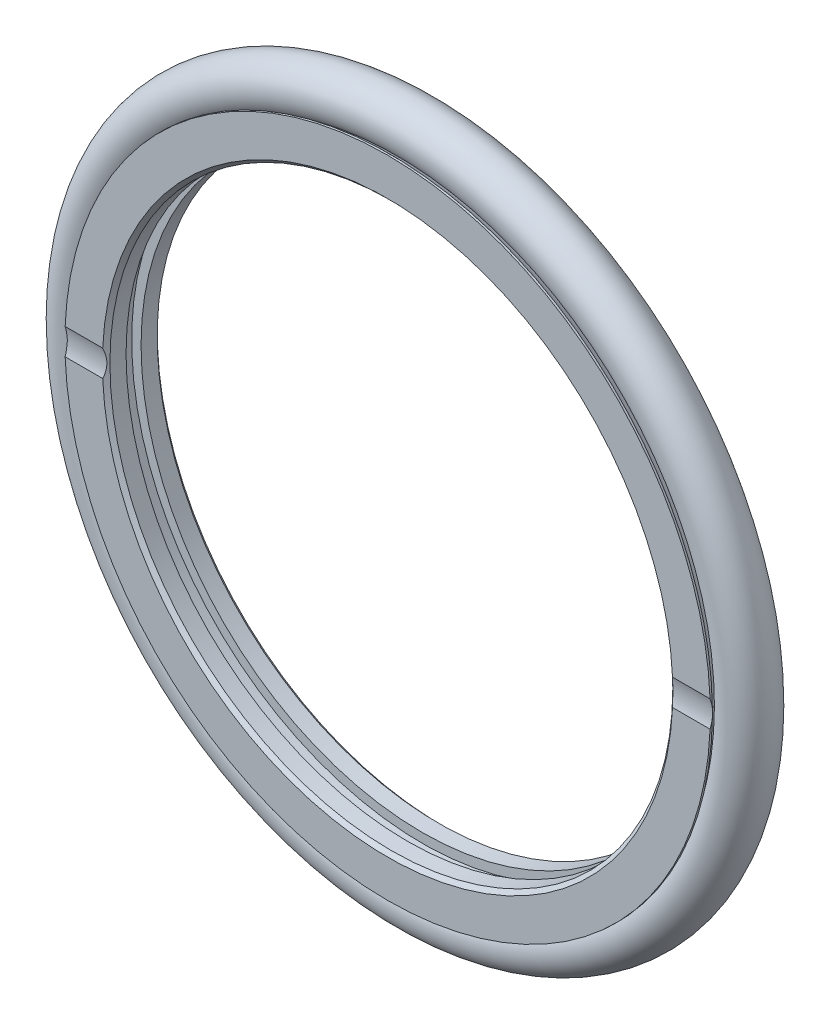
ISO-10303-21;
HEADER;
FILE_DESCRIPTION(('STEP AP214'),'2;1');
FILE_NAME('part.step','',(''),(''),'','','');
FILE_SCHEMA(('AUTOMOTIVE_DESIGN { 1 0 10303 214 1 1 1 1 }'));
ENDSEC;
DATA;
#1=APPLICATION_CONTEXT('core data for automotive mechanical design processes');
#2=APPLICATION_PROTOCOL_DEFINITION('international standard','automotive_design',2000,#1);
#3=PRODUCT_CONTEXT('',#1,'mechanical');
#4=PRODUCT('Part','Part','',(#3));
#5=PRODUCT_RELATED_PRODUCT_CATEGORY('part','',(#4));
#6=PRODUCT_DEFINITION_FORMATION('','',#4);
#7=PRODUCT_DEFINITION_CONTEXT('part definition',#1,'design');
#8=PRODUCT_DEFINITION('design','',#6,#7);
#9=PRODUCT_DEFINITION_SHAPE('','',#8);
#10=(LENGTH_UNIT() NAMED_UNIT(*) SI_UNIT(.MILLI.,.METRE.));
#11=(NAMED_UNIT(*) PLANE_ANGLE_UNIT() SI_UNIT($,.RADIAN.));
#12=(NAMED_UNIT(*) SI_UNIT($,.STERADIAN.) SOLID_ANGLE_UNIT());
#13=UNCERTAINTY_MEASURE_WITH_UNIT(LENGTH_MEASURE(1.E-05),#10,'distance_accuracy_value','');
#14=(GEOMETRIC_REPRESENTATION_CONTEXT(3) GLOBAL_UNCERTAINTY_ASSIGNED_CONTEXT((#13)) GLOBAL_UNIT_ASSIGNED_CONTEXT((#10,
#11,#12)) REPRESENTATION_CONTEXT('',''));
#15=CARTESIAN_POINT('',(0.,0.,0.));
#16=DIRECTION('',(0.,0.,1.));
#17=DIRECTION('',(1.,0.,0.));
#18=AXIS2_PLACEMENT_3D('',#15,#16,#17);
#19=CARTESIAN_POINT('',(0.,0.,0.));
#20=DIRECTION('',(0.,0.,1.));
#21=DIRECTION('',(1.,0.,0.));
#22=AXIS2_PLACEMENT_3D('',#19,#20,#21);
#23=TOROIDAL_SURFACE('',#22,17.805,1.31);
#24=CARTESIAN_POINT('',(19.115,0.,0.));
#25=VERTEX_POINT('',#24);
#26=VERTEX_LOOP('',#25);
#27=FACE_BOUND('',#26,.T.);
#28=ADVANCED_FACE('F53',(#27),#23,.T.);
#29=CLOSED_SHELL('',(#28));
#30=MANIFOLD_SOLID_BREP('B2',#29);
#31=CARTESIAN_POINT('',(0.,17.2,1.46));
#32=DIRECTION('',(0.,0.,-1.));
#33=DIRECTION('',(-1.,0.,0.));
#34=AXIS2_PLACEMENT_3D('',#31,#32,#33);
#35=PLANE('',#34);
#36=CARTESIAN_POINT('',(0.,0.,1.46));
#37=DIRECTION('',(0.,0.,1.));
#38=DIRECTION('',(1.,0.,0.));
#39=AXIS2_PLACEMENT_3D('',#36,#37,#38);
#40=CIRCLE('',#39,17.2);
#41=CARTESIAN_POINT('',(17.1857499109,0.7,1.46));
#42=VERTEX_POINT('',#41);
#43=CARTESIAN_POINT('',(-17.1857499109,0.7,1.46));
#44=VERTEX_POINT('',#43);
#45=EDGE_CURVE('E177',#42,#44,#40,.T.);
#46=ORIENTED_EDGE('',*,*,#45,.T.);
#47=DIRECTION('',(1.,0.,0.));
#48=VECTOR('',#47,1.);
#49=CARTESIAN_POINT('',(-17.2,0.7,1.46));
#50=LINE('',#49,#48);
#51=CARTESIAN_POINT('',(-15.1838730237051,0.7,1.46));
#52=VERTEX_POINT('',#51);
#53=EDGE_CURVE('E160',#44,#52,#50,.T.);
#54=ORIENTED_EDGE('',*,*,#53,.T.);
#55=CARTESIAN_POINT('',(0.,0.,1.46));
#56=DIRECTION('',(0.,0.,1.));
#57=DIRECTION('',(1.,0.,0.));
#58=AXIS2_PLACEMENT_3D('',#55,#56,#57);
#59=CIRCLE('',#58,15.2);
#60=CARTESIAN_POINT('',(15.1838730237051,0.7,1.46));
#61=VERTEX_POINT('',#60);
#62=EDGE_CURVE('E193',#61,#52,#59,.T.);
#63=ORIENTED_EDGE('',*,*,#62,.F.);
#64=EDGE_CURVE('E170',#61,#42,#50,.T.);
#65=ORIENTED_EDGE('',*,*,#64,.T.);
#66=EDGE_LOOP('',(#46,#54,#63,#65));
#67=FACE_BOUND('',#66,.T.);
#68=ADVANCED_FACE('F66',(#67),#35,.F.);
#69=CARTESIAN_POINT('',(0.,0.,0.));
#70=DIRECTION('',(0.,0.,1.));
#71=DIRECTION('',(1.,0.,0.));
#72=AXIS2_PLACEMENT_3D('',#69,#70,#71);
#73=CYLINDRICAL_SURFACE('',#72,17.2);
#74=CARTESIAN_POINT('',(0.,0.,1.35));
#75=DIRECTION('',(0.,0.,1.));
#76=DIRECTION('',(1.,0.,0.));
#77=AXIS2_PLACEMENT_3D('',#74,#75,#76);
#78=CIRCLE('',#77,17.2);
#79=CARTESIAN_POINT('',(-17.1987809645529,-0.204776300712103,1.35));
#80=VERTEX_POINT('',#79);
#81=CARTESIAN_POINT('',(17.1987809645529,-0.204776300712103,1.35));
#82=VERTEX_POINT('',#81);
#83=EDGE_CURVE('E197',#80,#82,#78,.T.);
#84=ORIENTED_EDGE('',*,*,#83,.T.);
#85=CARTESIAN_POINT('',(17.1987809645529,-0.204776300712103,1.35));
#86=CARTESIAN_POINT('',(17.1977392324289,-0.289562658618407,1.35834180085082));
#87=CARTESIAN_POINT('',(17.1961324452296,-0.373224479169303,1.37167936793952));
#88=CARTESIAN_POINT('',(17.1917887606792,-0.538299045599675,1.40834603460141));
#89=CARTESIAN_POINT('',(17.1890518633276,-0.619711791478078,1.43167513417938));
#90=CARTESIAN_POINT('',(17.1857499109,-0.7,1.46));
#91=B_SPLINE_CURVE_WITH_KNOTS('',3,(#85,#86,#87,#88,#89,#90),.UNSPECIFIED.,.F.,.F.,(4,2,4),(0.,
0.25420061783866,0.508401235798656),.UNSPECIFIED.);
#92=CARTESIAN_POINT('',(17.1857499109,-0.7,1.46));
#93=VERTEX_POINT('',#92);
#94=EDGE_CURVE('E89',#82,#93,#91,.T.);
#95=ORIENTED_EDGE('',*,*,#94,.T.);
#96=CARTESIAN_POINT('',(-17.1857499109,-0.7,1.46));
#97=VERTEX_POINT('',#96);
#98=EDGE_CURVE('E187',#97,#93,#40,.T.);
#99=ORIENTED_EDGE('',*,*,#98,.F.);
#100=CARTESIAN_POINT('',(-17.1857499109,-0.7,1.46));
#101=CARTESIAN_POINT('',(-17.1890518633276,-0.619711791478078,1.43167513417938));
#102=CARTESIAN_POINT('',(-17.1917887606792,-0.538299045599675,1.40834603460141));
#103=CARTESIAN_POINT('',(-17.1961324452296,-0.373224479169303,1.37167936793952));
#104=CARTESIAN_POINT('',(-17.1977392324289,-0.289562658618407,1.35834180085082));
#105=CARTESIAN_POINT('',(-17.1987809645529,-0.204776300712103,1.35));
#106=B_SPLINE_CURVE_WITH_KNOTS('',3,(#100,#101,#102,#103,#104,#105),.UNSPECIFIED.,.F.,.F.,(4,2,
4),(0.,0.254200617959995,0.508401235798656),.UNSPECIFIED.);
#107=EDGE_CURVE('E182',#97,#80,#106,.T.);
#108=ORIENTED_EDGE('',*,*,#107,.T.);
#109=EDGE_LOOP('',(#84,#95,#99,#108));
#110=FACE_BOUND('',#109,.T.);
#111=ADVANCED_FACE('F358',(#110),#73,.T.);
#112=CARTESIAN_POINT('',(0.,0.,0.));
#113=DIRECTION('',(0.,0.,1.));
#114=DIRECTION('',(1.,0.,0.));
#115=AXIS2_PLACEMENT_3D('',#112,#113,#114);
#116=CYLINDRICAL_SURFACE('',#115,17.2);
#117=CARTESIAN_POINT('',(0.,0.,-1.46));
#118=DIRECTION('',(0.,0.,1.));
#119=DIRECTION('',(1.,0.,0.));
#120=AXIS2_PLACEMENT_3D('',#117,#118,#119);
#121=CIRCLE('',#120,17.2);
#122=CARTESIAN_POINT('',(0.7,-17.1857499109,-1.46));
#123=VERTEX_POINT('',#122);
#124=CARTESIAN_POINT('',(0.7,17.1857499109,-1.46));
#125=VERTEX_POINT('',#124);
#126=EDGE_CURVE('E324',#123,#125,#121,.T.);
#127=ORIENTED_EDGE('',*,*,#126,.T.);
#128=CARTESIAN_POINT('',(0.7,17.1857499109,-1.46));
#129=CARTESIAN_POINT('',(0.619711791478081,17.1890518633276,-1.43167513417938));
#130=CARTESIAN_POINT('',(0.53829904559968,17.1917887606792,-1.40834603460141));
#131=CARTESIAN_POINT('',(0.373224479169314,17.1961324452296,-1.37167936793952));
#132=CARTESIAN_POINT('',(0.289562658618421,17.1977392324289,-1.35834180085082));
#133=CARTESIAN_POINT('',(0.20477630071212,17.1987809645529,-1.35));
#134=B_SPLINE_CURVE_WITH_KNOTS('',3,(#128,#129,#130,#131,#132,#133),.UNSPECIFIED.,.F.,.F.,(4,2,
4),(0.,0.254200617959987,0.508401235798639),.UNSPECIFIED.);
#135=CARTESIAN_POINT('',(0.20477630071212,17.1987809645529,-1.35));
#136=VERTEX_POINT('',#135);
#137=EDGE_CURVE('E253',#125,#136,#134,.T.);
#138=ORIENTED_EDGE('',*,*,#137,.T.);
#139=CARTESIAN_POINT('',(0.,0.,-1.35));
#140=DIRECTION('',(0.,0.,1.));
#141=DIRECTION('',(1.,0.,0.));
#142=AXIS2_PLACEMENT_3D('',#139,#140,#141);
#143=CIRCLE('',#142,17.2);
#144=CARTESIAN_POINT('',(0.20477630071212,-17.1987809645529,-1.35));
#145=VERTEX_POINT('',#144);
#146=EDGE_CURVE('E336',#145,#136,#143,.T.);
#147=ORIENTED_EDGE('',*,*,#146,.F.);
#148=CARTESIAN_POINT('',(0.20477630071212,-17.1987809645529,-1.35));
#149=CARTESIAN_POINT('',(0.28956265861842,-17.1977392324289,-1.35834180085082));
#150=CARTESIAN_POINT('',(0.373224479169313,-17.1961324452296,-1.37167936793952));
#151=CARTESIAN_POINT('',(0.53829904559968,-17.1917887606792,-1.40834603460141));
#152=CARTESIAN_POINT('',(0.619711791478081,-17.1890518633276,-1.43167513417938));
#153=CARTESIAN_POINT('',(0.7,-17.1857499109,-1.46));
#154=B_SPLINE_CURVE_WITH_KNOTS('',3,(#148,#149,#150,#151,#152,#153),.UNSPECIFIED.,.F.,.F.,(4,2,
4),(0.,0.254200617838652,0.508401235798639),.UNSPECIFIED.);
#155=EDGE_CURVE('E259',#145,#123,#154,.T.);
#156=ORIENTED_EDGE('',*,*,#155,.T.);
#157=EDGE_LOOP('',(#127,#138,#147,#156));
#158=FACE_BOUND('',#157,.T.);
#159=ADVANCED_FACE('F408',(#158),#116,.T.);
#160=CARTESIAN_POINT('',(0.,17.2,-1.46));
#161=DIRECTION('',(0.,0.,1.));
#162=DIRECTION('',(1.,0.,0.));
#163=AXIS2_PLACEMENT_3D('',#160,#161,#162);
#164=PLANE('',#163);
#165=ORIENTED_EDGE('',*,*,#126,.F.);
#166=DIRECTION('',(0.,1.,0.));
#167=VECTOR('',#166,1.);
#168=CARTESIAN_POINT('',(0.7,-17.2,-1.46));
#169=LINE('',#168,#167);
#170=CARTESIAN_POINT('',(0.7,-15.1838730237051,-1.46));
#171=VERTEX_POINT('',#170);
#172=EDGE_CURVE('E396',#123,#171,#169,.T.);
#173=ORIENTED_EDGE('',*,*,#172,.T.);
#174=CARTESIAN_POINT('',(0.,0.,-1.46));
#175=DIRECTION('',(0.,0.,1.));
#176=DIRECTION('',(1.,0.,0.));
#177=AXIS2_PLACEMENT_3D('',#174,#175,#176);
#178=CIRCLE('',#177,15.2);
#179=CARTESIAN_POINT('',(0.7,15.1838730237051,-1.46));
#180=VERTEX_POINT('',#179);
#181=EDGE_CURVE('E313',#171,#180,#178,.T.);
#182=ORIENTED_EDGE('',*,*,#181,.T.);
#183=EDGE_CURVE('E394',#180,#125,#169,.T.);
#184=ORIENTED_EDGE('',*,*,#183,.T.);
#185=EDGE_LOOP('',(#165,#173,#182,#184));
#186=FACE_BOUND('',#185,.T.);
#187=ADVANCED_FACE('F404',(#186),#164,.F.);
#188=CARTESIAN_POINT('',(0.,0.,1.46));
#189=DIRECTION('',(0.,0.,1.));
#190=DIRECTION('',(1.,0.,0.));
#191=AXIS2_PLACEMENT_3D('',#188,#189,#190);
#192=CONICAL_SURFACE('',#191,15.2,0.78539816339745);
#193=CARTESIAN_POINT('',(0.,0.,1.26));
#194=DIRECTION('',(0.,0.,1.));
#195=DIRECTION('',(1.,0.,0.));
#196=AXIS2_PLACEMENT_3D('',#193,#194,#195);
#197=CIRCLE('',#196,15.);
#198=CARTESIAN_POINT('',(15.,0.,1.26));
#199=VERTEX_POINT('',#198);
#200=EDGE_CURVE('E428',#199,#199,#197,.T.);
#201=ORIENTED_EDGE('',*,*,#200,.F.);
#202=EDGE_LOOP('',(#201));
#203=FACE_BOUND('',#202,.T.);
#204=ORIENTED_EDGE('',*,*,#62,.T.);
#205=CARTESIAN_POINT('',(-15.3363262889033,1.07160043894818,1.63371885850852));
#206=CARTESIAN_POINT('',(-15.316281355535,1.03336616726748,1.61105810348584));
#207=CARTESIAN_POINT('',(-15.2971829677057,0.994055866713644,1.58939753732753));
#208=CARTESIAN_POINT('',(-15.2610379641263,0.913345522778011,1.5482941876393));
#209=CARTESIAN_POINT('',(-15.2439929010767,0.871943931147231,1.52885308301455));
#210=CARTESIAN_POINT('',(-15.1961082003103,0.744488750041517,1.47410760315877));
#211=CARTESIAN_POINT('',(-15.1686615554192,0.655453087574942,1.44254269385198));
#212=CARTESIAN_POINT('',(-15.1247155865009,0.473331059865425,1.39185732546658));
#213=CARTESIAN_POINT('',(-15.1080097976256,0.380360163986072,1.37250230957632));
#214=CARTESIAN_POINT('',(-15.0856678617354,0.191587612316566,1.34659195935045));
#215=CARTESIAN_POINT('',(-15.0799997539591,0.0957949473990466,1.33999966952851));
#216=CARTESIAN_POINT('',(-15.0800002489586,-0.0969309636222396,1.3400003343905));
#217=CARTESIAN_POINT('',(-15.0858040890013,-0.193864264182131,1.34675057776504));
#218=CARTESIAN_POINT('',(-15.1086758073576,-0.384816939656692,1.37327405684536));
#219=CARTESIAN_POINT('',(-15.1257771803937,-0.478826776662457,1.39308601734037));
#220=CARTESIAN_POINT('',(-15.1702078665464,-0.66068915947792,1.44432163148536));
#221=CARTESIAN_POINT('',(-15.1975017404375,-0.748561801983848,1.47570504657393));
#222=CARTESIAN_POINT('',(-15.2449856021778,-0.874394380141808,1.52998579282402));
#223=CARTESIAN_POINT('',(-15.2618663691537,-0.915271509261617,1.54923756055957));
#224=CARTESIAN_POINT('',(-15.2976330257845,-0.994982055855522,1.58990795234074));
#225=CARTESIAN_POINT('',(-15.3165174928205,-1.03381689443366,1.6113250385165));
#226=CARTESIAN_POINT('',(-15.3363262889033,-1.07160043894818,1.63371885850852));
#227=B_SPLINE_CURVE_WITH_KNOTS('',3,(#205,#206,#207,#208,#209,#210,#211,#212,#213,#214,#215,
#216,#217,#218,#219,#220,#221,#222,#223,#224,#225,#226),.UNSPECIFIED.,.F.,.F.,(4,2,2,2,2,2,2,2,
2,2,4),(0.,0.146209279692409,0.292528436222056,0.58618813574808,0.874019431273205,
1.16101603451907,1.45141608237319,1.74268099038818,2.0329424622924,2.17753263075007,
2.32202081914584),.UNSPECIFIED.);
#228=CARTESIAN_POINT('',(-15.1838730237051,-0.7,1.46));
#229=VERTEX_POINT('',#228);
#230=EDGE_CURVE('E163',#52,#229,#227,.T.);
#231=ORIENTED_EDGE('',*,*,#230,.T.);
#232=CARTESIAN_POINT('',(15.1838730237051,-0.7,1.46));
#233=VERTEX_POINT('',#232);
#234=EDGE_CURVE('E186',#229,#233,#59,.T.);
#235=ORIENTED_EDGE('',*,*,#234,.T.);
#236=CARTESIAN_POINT('',(15.3363262889033,-1.07160043894818,1.63371885850852));
#237=CARTESIAN_POINT('',(15.316281355535,-1.03336616726747,1.61105810348584));
#238=CARTESIAN_POINT('',(15.2971829677057,-0.99405586671364,1.58939753732753));
#239=CARTESIAN_POINT('',(15.2610379641263,-0.913345522778007,1.5482941876393));
#240=CARTESIAN_POINT('',(15.2439929010767,-0.871943931147227,1.52885308301455));
#241=CARTESIAN_POINT('',(15.1961082003103,-0.744488750041514,1.47410760315877));
#242=CARTESIAN_POINT('',(15.1686615554192,-0.65545308757494,1.44254269385198));
#243=CARTESIAN_POINT('',(15.1247155865009,-0.473331059865423,1.39185732546658));
#244=CARTESIAN_POINT('',(15.1080097976256,-0.380360163986071,1.37250230957632));
#245=CARTESIAN_POINT('',(15.0856678617354,-0.191587612316565,1.34659195935045));
#246=CARTESIAN_POINT('',(15.0799997539591,-0.0957949473990464,1.33999966952851));
#247=CARTESIAN_POINT('',(15.0800002489586,0.0969309636222392,1.3400003343905));
#248=CARTESIAN_POINT('',(15.0858040890013,0.19386426418213,1.34675057776504));
#249=CARTESIAN_POINT('',(15.1086758073576,0.38481693965669,1.37327405684536));
#250=CARTESIAN_POINT('',(15.1257771803937,0.478826776662454,1.39308601734037));
#251=CARTESIAN_POINT('',(15.1702078665464,0.660689159477917,1.44432163148536));
#252=CARTESIAN_POINT('',(15.1975017404375,0.748561801983845,1.47570504657393));
#253=CARTESIAN_POINT('',(15.2449856021778,0.874394380141805,1.52998579282401));
#254=CARTESIAN_POINT('',(15.2618663691537,0.915271509261613,1.54923756055957));
#255=CARTESIAN_POINT('',(15.2976330257845,0.994982055855518,1.58990795234074));
#256=CARTESIAN_POINT('',(15.3165174928205,1.03381689443365,1.61132503851649));
#257=CARTESIAN_POINT('',(15.3363262889033,1.07160043894818,1.63371885850852));
#258=B_SPLINE_CURVE_WITH_KNOTS('',3,(#236,#237,#238,#239,#240,#241,#242,#243,#244,#245,#246,
#247,#248,#249,#250,#251,#252,#253,#254,#255,#256,#257),.UNSPECIFIED.,.F.,.F.,(4,2,2,2,2,2,2,2,
2,2,4),(0.,0.146209279692408,0.292528436222055,0.586188135748077,0.874019431273201,
1.16101603451906,1.45141608237318,1.74268099038817,2.03294246229239,2.17753263075006,
2.32202081914583),.UNSPECIFIED.);
#259=EDGE_CURVE('E365',#233,#61,#258,.T.);
#260=ORIENTED_EDGE('',*,*,#259,.T.);
#261=EDGE_LOOP('',(#204,#231,#235,#260));
#262=FACE_BOUND('',#261,.T.);
#263=ADVANCED_FACE('F68',(#203,#262),#192,.F.);
#264=ORIENTED_EDGE('',*,*,#98,.T.);
#265=DIRECTION('',(1.,0.,0.));
#266=VECTOR('',#265,1.);
#267=CARTESIAN_POINT('',(-17.2,-0.7,1.46));
#268=LINE('',#267,#266);
#269=EDGE_CURVE('E169',#233,#93,#268,.T.);
#270=ORIENTED_EDGE('',*,*,#269,.F.);
#271=ORIENTED_EDGE('',*,*,#234,.F.);
#272=EDGE_CURVE('E484',#97,#229,#268,.T.);
#273=ORIENTED_EDGE('',*,*,#272,.F.);
#274=EDGE_LOOP('',(#264,#270,#271,#273));
#275=FACE_BOUND('',#274,.T.);
#276=ADVANCED_FACE('F469',(#275),#35,.F.);
#277=CARTESIAN_POINT('',(17.1987809645529,0.204776300712103,1.35));
#278=VERTEX_POINT('',#277);
#279=CARTESIAN_POINT('',(-17.1987809645529,0.204776300712103,1.35));
#280=VERTEX_POINT('',#279);
#281=EDGE_CURVE('E179',#278,#280,#78,.T.);
#282=ORIENTED_EDGE('',*,*,#281,.T.);
#283=CARTESIAN_POINT('',(-17.1987809645529,0.204776300712103,1.35));
#284=CARTESIAN_POINT('',(-17.1977392324289,0.289562658618407,1.35834180085082));
#285=CARTESIAN_POINT('',(-17.1961324452296,0.373224479169302,1.37167936793952));
#286=CARTESIAN_POINT('',(-17.1917887606792,0.538299045599675,1.40834603460141));
#287=CARTESIAN_POINT('',(-17.1890518633276,0.619711791478078,1.43167513417938));
#288=CARTESIAN_POINT('',(-17.1857499109,0.7,1.46));
#289=B_SPLINE_CURVE_WITH_KNOTS('',3,(#283,#284,#285,#286,#287,#288),.UNSPECIFIED.,.F.,.F.,(4,2,
4),(0.,0.25420061783866,0.508401235798655),.UNSPECIFIED.);
#290=EDGE_CURVE('E96',#280,#44,#289,.T.);
#291=ORIENTED_EDGE('',*,*,#290,.T.);
#292=ORIENTED_EDGE('',*,*,#45,.F.);
#293=CARTESIAN_POINT('',(17.1857499109,0.7,1.46));
#294=CARTESIAN_POINT('',(17.1890518633276,0.619711791478078,1.43167513417938));
#295=CARTESIAN_POINT('',(17.1917887606792,0.538299045599675,1.40834603460141));
#296=CARTESIAN_POINT('',(17.1961324452296,0.373224479169303,1.37167936793952));
#297=CARTESIAN_POINT('',(17.1977392324289,0.289562658618407,1.35834180085082));
#298=CARTESIAN_POINT('',(17.1987809645529,0.204776300712103,1.35));
#299=B_SPLINE_CURVE_WITH_KNOTS('',3,(#293,#294,#295,#296,#297,#298),.UNSPECIFIED.,.F.,.F.,(4,2,
4),(0.,0.254200617959995,0.508401235798656),.UNSPECIFIED.);
#300=EDGE_CURVE('E181',#42,#278,#299,.T.);
#301=ORIENTED_EDGE('',*,*,#300,.T.);
#302=EDGE_LOOP('',(#282,#291,#292,#301));
#303=FACE_BOUND('',#302,.T.);
#304=ADVANCED_FACE('F175',(#303),#73,.T.);
#305=CARTESIAN_POINT('',(0.,0.,0.522730394611288));
#306=DIRECTION('',(0.,0.,1.));
#307=DIRECTION('',(1.,0.,0.));
#308=AXIS2_PLACEMENT_3D('',#305,#306,#307);
#309=TOROIDAL_SURFACE('',#308,17.925,1.1);
#310=ORIENTED_EDGE('',*,*,#281,.F.);
#311=CARTESIAN_POINT('',(17.2002000000003,0.218497441181234,1.35138877940502));
#312=CARTESIAN_POINT('',(17.1963330779955,0.182249197764835,1.34759532105829));
#313=CARTESIAN_POINT('',(17.1934644333575,0.145800284616739,1.34474294584655));
#314=CARTESIAN_POINT('',(17.1896759781416,0.0729001940055116,1.34095041950855));
#315=CARTESIAN_POINT('',(17.1887457014673,0.036450097002855,1.34));
#316=CARTESIAN_POINT('',(17.1887457014675,-0.0364500970023807,1.34));
#317=CARTESIAN_POINT('',(17.1896759781421,-0.0729001940049598,1.34095041950853));
#318=CARTESIAN_POINT('',(17.193464433357,-0.145800284616136,1.34474294584651));
#319=CARTESIAN_POINT('',(17.1963330779939,-0.182249197764259,1.34759532105823));
#320=CARTESIAN_POINT('',(17.2001999999962,-0.218497441180816,1.35138877940494));
#321=B_SPLINE_CURVE_WITH_KNOTS('',3,(#311,#312,#313,#314,#315,#316,#317,#318,#319,#320),
.UNSPECIFIED.,.F.,.F.,(4,2,2,2,4),(0.,0.109919674733263,0.219244290610462,0.328568906487505,
0.438488581220607),.UNSPECIFIED.);
#322=EDGE_CURVE('E51',#278,#82,#321,.T.);
#323=ORIENTED_EDGE('',*,*,#322,.T.);
#324=ORIENTED_EDGE('',*,*,#83,.F.);
#325=CARTESIAN_POINT('',(-17.2002000000003,-0.218497441181258,1.35138877940502));
#326=CARTESIAN_POINT('',(-17.1963330779955,-0.18224919776486,1.34759532105829));
#327=CARTESIAN_POINT('',(-17.1934644333575,-0.145800284616764,1.34474294584655));
#328=CARTESIAN_POINT('',(-17.1896759781416,-0.0729001940055361,1.34095041950855));
#329=CARTESIAN_POINT('',(-17.1887457014673,-0.0364500970028793,1.34));
#330=CARTESIAN_POINT('',(-17.1887457014675,0.0364500970023565,1.34));
#331=CARTESIAN_POINT('',(-17.1896759781421,0.0729001940049356,1.34095041950853));
#332=CARTESIAN_POINT('',(-17.193464433357,0.145800284616112,1.34474294584651));
#333=CARTESIAN_POINT('',(-17.1963330779939,0.182249197764235,1.34759532105823));
#334=CARTESIAN_POINT('',(-17.2001999999962,0.218497441180792,1.35138877940494));
#335=B_SPLINE_CURVE_WITH_KNOTS('',3,(#325,#326,#327,#328,#329,#330,#331,#332,#333,#334),
.UNSPECIFIED.,.F.,.F.,(4,2,2,2,4),(0.,0.109919674733263,0.219244290610462,0.328568906487505,
0.438488581220608),.UNSPECIFIED.);
#336=EDGE_CURVE('E82',#80,#280,#335,.T.);
#337=ORIENTED_EDGE('',*,*,#336,.T.);
#338=EDGE_LOOP('',(#310,#323,#324,#337));
#339=FACE_BOUND('',#338,.T.);
#340=CARTESIAN_POINT('',(0.,0.,0.522730394611288));
#341=DIRECTION('',(0.,0.,1.));
#342=DIRECTION('',(1.,0.,0.));
#343=AXIS2_PLACEMENT_3D('',#340,#341,#342);
#344=CIRCLE('',#343,16.825);
#345=CARTESIAN_POINT('',(16.825,0.,0.522730394611288));
#346=VERTEX_POINT('',#345);
#347=EDGE_CURVE('E344',#346,#346,#344,.T.);
#348=ORIENTED_EDGE('',*,*,#347,.T.);
#349=EDGE_LOOP('',(#348));
#350=FACE_BOUND('',#349,.T.);
#351=ADVANCED_FACE('F288',(#339,#350),#309,.F.);
#352=CARTESIAN_POINT('',(0.,0.,0.));
#353=DIRECTION('',(0.,0.,1.));
#354=DIRECTION('',(1.,0.,0.));
#355=AXIS2_PLACEMENT_3D('',#352,#353,#354);
#356=CYLINDRICAL_SURFACE('',#355,16.825);
#357=ORIENTED_EDGE('',*,*,#347,.F.);
#358=EDGE_LOOP('',(#357));
#359=FACE_BOUND('',#358,.T.);
#360=CARTESIAN_POINT('',(0.,0.,-0.522730394611288));
#361=DIRECTION('',(0.,0.,1.));
#362=DIRECTION('',(1.,0.,0.));
#363=AXIS2_PLACEMENT_3D('',#360,#361,#362);
#364=CIRCLE('',#363,16.825);
#365=CARTESIAN_POINT('',(16.825,0.,-0.522730394611288));
#366=VERTEX_POINT('',#365);
#367=EDGE_CURVE('E341',#366,#366,#364,.T.);
#368=ORIENTED_EDGE('',*,*,#367,.T.);
#369=EDGE_LOOP('',(#368));
#370=FACE_BOUND('',#369,.T.);
#371=ADVANCED_FACE('F283',(#359,#370),#356,.T.);
#372=CARTESIAN_POINT('',(0.,0.,-0.522730394611288));
#373=DIRECTION('',(0.,0.,1.));
#374=DIRECTION('',(1.,0.,0.));
#375=AXIS2_PLACEMENT_3D('',#372,#373,#374);
#376=TOROIDAL_SURFACE('',#375,17.925,1.1);
#377=ORIENTED_EDGE('',*,*,#367,.F.);
#378=EDGE_LOOP('',(#377));
#379=FACE_BOUND('',#378,.T.);
#380=ORIENTED_EDGE('',*,*,#146,.T.);
#381=CARTESIAN_POINT('',(0.218497441181234,17.2002000000003,-1.35138877940502));
#382=CARTESIAN_POINT('',(0.182249197764836,17.1963330779955,-1.34759532105829));
#383=CARTESIAN_POINT('',(0.145800284616739,17.1934644333575,-1.34474294584655));
#384=CARTESIAN_POINT('',(0.0729001940055111,17.1896759781416,-1.34095041950855));
#385=CARTESIAN_POINT('',(0.0364500970028543,17.1887457014673,-1.34));
#386=CARTESIAN_POINT('',(-0.0364500970023819,17.1887457014675,-1.34));
#387=CARTESIAN_POINT('',(-0.0729001940049611,17.1896759781421,-1.34095041950853));
#388=CARTESIAN_POINT('',(-0.145800284616137,17.193464433357,-1.34474294584651));
#389=CARTESIAN_POINT('',(-0.182249197764261,17.1963330779939,-1.34759532105823));
#390=CARTESIAN_POINT('',(-0.218497441180818,17.2001999999962,-1.35138877940494));
#391=B_SPLINE_CURVE_WITH_KNOTS('',3,(#381,#382,#383,#384,#385,#386,#387,#388,#389,#390),
.UNSPECIFIED.,.F.,.F.,(4,2,2,2,4),(0.,0.109919674733264,0.219244290610463,0.328568906487507,
0.43848858122061),.UNSPECIFIED.);
#392=CARTESIAN_POINT('',(-0.20477630071212,17.1987809645529,-1.35));
#393=VERTEX_POINT('',#392);
#394=EDGE_CURVE('E245',#136,#393,#391,.T.);
#395=ORIENTED_EDGE('',*,*,#394,.T.);
#396=CARTESIAN_POINT('',(-0.20477630071212,-17.1987809645529,-1.35));
#397=VERTEX_POINT('',#396);
#398=EDGE_CURVE('E340',#393,#397,#143,.T.);
#399=ORIENTED_EDGE('',*,*,#398,.T.);
#400=CARTESIAN_POINT('',(-0.21849744118126,-17.2002000000003,-1.35138877940502));
#401=CARTESIAN_POINT('',(-0.182249197764862,-17.1963330779955,-1.34759532105829));
#402=CARTESIAN_POINT('',(-0.145800284616765,-17.1934644333575,-1.34474294584655));
#403=CARTESIAN_POINT('',(-0.0729001940055374,-17.1896759781416,-1.34095041950855));
#404=CARTESIAN_POINT('',(-0.0364500970028804,-17.1887457014673,-1.34));
#405=CARTESIAN_POINT('',(0.0364500970023559,-17.1887457014675,-1.34));
#406=CARTESIAN_POINT('',(0.0729001940049352,-17.1896759781421,-1.34095041950853));
#407=CARTESIAN_POINT('',(0.145800284616112,-17.193464433357,-1.34474294584651));
#408=CARTESIAN_POINT('',(0.182249197764235,-17.1963330779939,-1.34759532105823));
#409=CARTESIAN_POINT('',(0.218497441180793,-17.2001999999962,-1.35138877940494));
#410=B_SPLINE_CURVE_WITH_KNOTS('',3,(#400,#401,#402,#403,#404,#405,#406,#407,#408,#409),
.UNSPECIFIED.,.F.,.F.,(4,2,2,2,4),(0.,0.109919674733264,0.219244290610464,0.328568906487508,
0.43848858122061),.UNSPECIFIED.);
#411=EDGE_CURVE('E265',#397,#145,#410,.T.);
#412=ORIENTED_EDGE('',*,*,#411,.T.);
#413=EDGE_LOOP('',(#380,#395,#399,#412));
#414=FACE_BOUND('',#413,.T.);
#415=ADVANCED_FACE('F278',(#379,#414),#376,.F.);
#416=CARTESIAN_POINT('',(-0.7,17.1857499109,-1.46));
#417=VERTEX_POINT('',#416);
#418=CARTESIAN_POINT('',(-0.7,-17.1857499109,-1.46));
#419=VERTEX_POINT('',#418);
#420=EDGE_CURVE('E330',#417,#419,#121,.T.);
#421=ORIENTED_EDGE('',*,*,#420,.T.);
#422=CARTESIAN_POINT('',(-0.7,-17.1857499109,-1.46));
#423=CARTESIAN_POINT('',(-0.619711791478081,-17.1890518633276,-1.43167513417938));
#424=CARTESIAN_POINT('',(-0.538299045599681,-17.1917887606792,-1.40834603460141));
#425=CARTESIAN_POINT('',(-0.373224479169314,-17.1961324452296,-1.37167936793952));
#426=CARTESIAN_POINT('',(-0.289562658618421,-17.1977392324289,-1.35834180085082));
#427=CARTESIAN_POINT('',(-0.20477630071212,-17.1987809645529,-1.35));
#428=B_SPLINE_CURVE_WITH_KNOTS('',3,(#422,#423,#424,#425,#426,#427),.UNSPECIFIED.,.F.,.F.,(4,2,
4),(0.,0.254200617959987,0.508401235798639),.UNSPECIFIED.);
#429=EDGE_CURVE('E272',#419,#397,#428,.T.);
#430=ORIENTED_EDGE('',*,*,#429,.T.);
#431=ORIENTED_EDGE('',*,*,#398,.F.);
#432=CARTESIAN_POINT('',(-0.20477630071212,17.1987809645529,-1.35));
#433=CARTESIAN_POINT('',(-0.289562658618421,17.1977392324289,-1.35834180085082));
#434=CARTESIAN_POINT('',(-0.373224479169314,17.1961324452296,-1.37167936793952));
#435=CARTESIAN_POINT('',(-0.53829904559968,17.1917887606792,-1.40834603460141));
#436=CARTESIAN_POINT('',(-0.619711791478081,17.1890518633276,-1.43167513417938));
#437=CARTESIAN_POINT('',(-0.7,17.1857499109,-1.46));
#438=B_SPLINE_CURVE_WITH_KNOTS('',3,(#432,#433,#434,#435,#436,#437),.UNSPECIFIED.,.F.,.F.,(4,2,
4),(0.,0.254200617838652,0.508401235798639),.UNSPECIFIED.);
#439=EDGE_CURVE('E236',#393,#417,#438,.T.);
#440=ORIENTED_EDGE('',*,*,#439,.T.);
#441=EDGE_LOOP('',(#421,#430,#431,#440));
#442=FACE_BOUND('',#441,.T.);
#443=ADVANCED_FACE('F282',(#442),#116,.T.);
#444=ORIENTED_EDGE('',*,*,#420,.F.);
#445=DIRECTION('',(0.,1.,0.));
#446=VECTOR('',#445,1.);
#447=CARTESIAN_POINT('',(-0.7,-17.2,-1.46));
#448=LINE('',#447,#446);
#449=CARTESIAN_POINT('',(-0.7,15.1838730237051,-1.46));
#450=VERTEX_POINT('',#449);
#451=EDGE_CURVE('E322',#450,#417,#448,.T.);
#452=ORIENTED_EDGE('',*,*,#451,.F.);
#453=CARTESIAN_POINT('',(-0.7,-15.1838730237051,-1.46));
#454=VERTEX_POINT('',#453);
#455=EDGE_CURVE('E311',#450,#454,#178,.T.);
#456=ORIENTED_EDGE('',*,*,#455,.T.);
#457=EDGE_CURVE('E320',#419,#454,#448,.T.);
#458=ORIENTED_EDGE('',*,*,#457,.F.);
#459=EDGE_LOOP('',(#444,#452,#456,#458));
#460=FACE_BOUND('',#459,.T.);
#461=ADVANCED_FACE('F319',(#460),#164,.F.);
#462=CARTESIAN_POINT('',(0.,0.,-1.26));
#463=DIRECTION('',(0.,0.,-1.));
#464=DIRECTION('',(-1.,0.,0.));
#465=AXIS2_PLACEMENT_3D('',#462,#463,#464);
#466=CONICAL_SURFACE('',#465,15.,0.785398163397449);
#467=ORIENTED_EDGE('',*,*,#181,.F.);
#468=CARTESIAN_POINT('',(1.07160043894818,-15.3363262889033,-1.63371885850852));
#469=CARTESIAN_POINT('',(1.03336616726748,-15.316281355535,-1.61105810348584));
#470=CARTESIAN_POINT('',(0.994055866713644,-15.2971829677057,-1.58939753732753));
#471=CARTESIAN_POINT('',(0.913345522778011,-15.2610379641263,-1.5482941876393));
#472=CARTESIAN_POINT('',(0.87194393114723,-15.2439929010767,-1.52885308301455));
#473=CARTESIAN_POINT('',(0.744488750041516,-15.1961082003103,-1.47410760315877));
#474=CARTESIAN_POINT('',(0.655453087574942,-15.1686615554192,-1.44254269385198));
#475=CARTESIAN_POINT('',(0.473331059865424,-15.1247155865009,-1.39185732546658));
#476=CARTESIAN_POINT('',(0.380360163986072,-15.1080097976256,-1.37250230957632));
#477=CARTESIAN_POINT('',(0.191587612316565,-15.0856678617354,-1.34659195935045));
#478=CARTESIAN_POINT('',(0.0957949473990461,-15.0799997539591,-1.33999966952851));
#479=CARTESIAN_POINT('',(-0.0969309636222399,-15.0800002489586,-1.3400003343905));
#480=CARTESIAN_POINT('',(-0.193864264182131,-15.0858040890013,-1.34675057776504));
#481=CARTESIAN_POINT('',(-0.384816939656692,-15.1086758073576,-1.37327405684536));
#482=CARTESIAN_POINT('',(-0.478826776662457,-15.1257771803937,-1.39308601734037));
#483=CARTESIAN_POINT('',(-0.66068915947792,-15.1702078665464,-1.44432163148536));
#484=CARTESIAN_POINT('',(-0.748561801983848,-15.1975017404375,-1.47570504657393));
#485=CARTESIAN_POINT('',(-0.874394380141808,-15.2449856021778,-1.52998579282402));
#486=CARTESIAN_POINT('',(-0.915271509261617,-15.2618663691537,-1.54923756055957));
#487=CARTESIAN_POINT('',(-0.994982055855522,-15.2976330257845,-1.58990795234074));
#488=CARTESIAN_POINT('',(-1.03381689443366,-15.3165174928205,-1.6113250385165));
#489=CARTESIAN_POINT('',(-1.07160043894818,-15.3363262889033,-1.63371885850852));
#490=B_SPLINE_CURVE_WITH_KNOTS('',3,(#468,#469,#470,#471,#472,#473,#474,#475,#476,#477,#478,
#479,#480,#481,#482,#483,#484,#485,#486,#487,#488,#489),.UNSPECIFIED.,.F.,.F.,(4,2,2,2,2,2,2,2,
2,2,4),(0.,0.146209279692409,0.292528436222057,0.58618813574808,0.874019431273205,
1.16101603451907,1.45141608237319,1.74268099038818,2.0329424622924,2.17753263075007,
2.32202081914584),.UNSPECIFIED.);
#491=EDGE_CURVE('E211',#171,#454,#490,.T.);
#492=ORIENTED_EDGE('',*,*,#491,.T.);
#493=ORIENTED_EDGE('',*,*,#455,.F.);
#494=CARTESIAN_POINT('',(-1.07160043894818,15.3363262889033,-1.63371885850852));
#495=CARTESIAN_POINT('',(-1.03336616726747,15.316281355535,-1.61105810348584));
#496=CARTESIAN_POINT('',(-0.99405586671364,15.2971829677057,-1.58939753732753));
#497=CARTESIAN_POINT('',(-0.913345522778008,15.2610379641263,-1.5482941876393));
#498=CARTESIAN_POINT('',(-0.871943931147228,15.2439929010767,-1.52885308301455));
#499=CARTESIAN_POINT('',(-0.744488750041514,15.1961082003103,-1.47410760315877));
#500=CARTESIAN_POINT('',(-0.655453087574939,15.1686615554192,-1.44254269385198));
#501=CARTESIAN_POINT('',(-0.473331059865422,15.1247155865009,-1.39185732546658));
#502=CARTESIAN_POINT('',(-0.38036016398607,15.1080097976256,-1.37250230957632));
#503=CARTESIAN_POINT('',(-0.191587612316565,15.0856678617354,-1.34659195935045));
#504=CARTESIAN_POINT('',(-0.0957949473990461,15.0799997539591,-1.33999966952851));
#505=CARTESIAN_POINT('',(0.0969309636222394,15.0800002489586,-1.3400003343905));
#506=CARTESIAN_POINT('',(0.19386426418213,15.0858040890013,-1.34675057776504));
#507=CARTESIAN_POINT('',(0.38481693965669,15.1086758073576,-1.37327405684536));
#508=CARTESIAN_POINT('',(0.478826776662454,15.1257771803937,-1.39308601734037));
#509=CARTESIAN_POINT('',(0.660689159477917,15.1702078665464,-1.44432163148536));
#510=CARTESIAN_POINT('',(0.748561801983845,15.1975017404375,-1.47570504657393));
#511=CARTESIAN_POINT('',(0.874394380141805,15.2449856021778,-1.52998579282401));
#512=CARTESIAN_POINT('',(0.915271509261613,15.2618663691537,-1.54923756055957));
#513=CARTESIAN_POINT('',(0.994982055855518,15.2976330257845,-1.58990795234074));
#514=CARTESIAN_POINT('',(1.03381689443365,15.3165174928205,-1.61132503851649));
#515=CARTESIAN_POINT('',(1.07160043894818,15.3363262889033,-1.63371885850852));
#516=B_SPLINE_CURVE_WITH_KNOTS('',3,(#494,#495,#496,#497,#498,#499,#500,#501,#502,#503,#504,
#505,#506,#507,#508,#509,#510,#511,#512,#513,#514,#515),.UNSPECIFIED.,.F.,.F.,(4,2,2,2,2,2,2,2,
2,2,4),(0.,0.146209279692408,0.292528436222055,0.586188135748078,0.874019431273202,
1.16101603451906,1.45141608237318,1.74268099038817,2.03294246229239,2.17753263075006,
2.32202081914583),.UNSPECIFIED.);
#517=EDGE_CURVE('E201',#450,#180,#516,.T.);
#518=ORIENTED_EDGE('',*,*,#517,.T.);
#519=EDGE_LOOP('',(#467,#492,#493,#518));
#520=FACE_BOUND('',#519,.T.);
#521=CARTESIAN_POINT('',(0.,0.,-1.26));
#522=DIRECTION('',(0.,0.,1.));
#523=DIRECTION('',(1.,0.,0.));
#524=AXIS2_PLACEMENT_3D('',#521,#522,#523);
#525=CIRCLE('',#524,15.);
#526=CARTESIAN_POINT('',(15.,0.,-1.26));
#527=VERTEX_POINT('',#526);
#528=EDGE_CURVE('E332',#527,#527,#525,.T.);
#529=ORIENTED_EDGE('',*,*,#528,.T.);
#530=EDGE_LOOP('',(#529));
#531=FACE_BOUND('',#530,.T.);
#532=ADVANCED_FACE('F216',(#520,#531),#466,.F.);
#533=CARTESIAN_POINT('',(0.,0.,0.));
#534=DIRECTION('',(0.,0.,1.));
#535=DIRECTION('',(1.,0.,0.));
#536=AXIS2_PLACEMENT_3D('',#533,#534,#535);
#537=CYLINDRICAL_SURFACE('',#536,15.);
#538=ORIENTED_EDGE('',*,*,#528,.F.);
#539=EDGE_LOOP('',(#538));
#540=FACE_BOUND('',#539,.T.);
#541=CARTESIAN_POINT('',(0.,0.,-0.4));
#542=DIRECTION('',(0.,0.,1.));
#543=DIRECTION('',(1.,0.,0.));
#544=AXIS2_PLACEMENT_3D('',#541,#542,#543);
#545=CIRCLE('',#544,15.);
#546=CARTESIAN_POINT('',(15.,0.,-0.4));
#547=VERTEX_POINT('',#546);
#548=EDGE_CURVE('E447',#547,#547,#545,.T.);
#549=ORIENTED_EDGE('',*,*,#548,.T.);
#550=EDGE_LOOP('',(#549));
#551=FACE_BOUND('',#550,.T.);
#552=ADVANCED_FACE('F458',(#540,#551),#537,.F.);
#553=CARTESIAN_POINT('',(0.,15.,-0.4));
#554=DIRECTION('',(0.,0.,-1.));
#555=DIRECTION('',(-1.,0.,0.));
#556=AXIS2_PLACEMENT_3D('',#553,#554,#555);
#557=PLANE('',#556);
#558=ORIENTED_EDGE('',*,*,#548,.F.);
#559=EDGE_LOOP('',(#558));
#560=FACE_BOUND('',#559,.T.);
#561=CARTESIAN_POINT('',(0.,0.,-0.4));
#562=DIRECTION('',(0.,0.,1.));
#563=DIRECTION('',(1.,0.,0.));
#564=AXIS2_PLACEMENT_3D('',#561,#562,#563);
#565=CIRCLE('',#564,15.5);
#566=CARTESIAN_POINT('',(15.5,0.,-0.4));
#567=VERTEX_POINT('',#566);
#568=EDGE_CURVE('E444',#567,#567,#565,.T.);
#569=ORIENTED_EDGE('',*,*,#568,.T.);
#570=EDGE_LOOP('',(#569));
#571=FACE_BOUND('',#570,.T.);
#572=ADVANCED_FACE('F460',(#560,#571),#557,.F.);
#573=CARTESIAN_POINT('',(0.,0.,0.));
#574=DIRECTION('',(0.,0.,1.));
#575=DIRECTION('',(1.,0.,0.));
#576=AXIS2_PLACEMENT_3D('',#573,#574,#575);
#577=CYLINDRICAL_SURFACE('',#576,15.5);
#578=ORIENTED_EDGE('',*,*,#568,.F.);
#579=EDGE_LOOP('',(#578));
#580=FACE_BOUND('',#579,.T.);
#581=CARTESIAN_POINT('',(0.,0.,0.4));
#582=DIRECTION('',(0.,0.,1.));
#583=DIRECTION('',(1.,0.,0.));
#584=AXIS2_PLACEMENT_3D('',#581,#582,#583);
#585=CIRCLE('',#584,15.5);
#586=CARTESIAN_POINT('',(15.5,0.,0.4));
#587=VERTEX_POINT('',#586);
#588=EDGE_CURVE('E438',#587,#587,#585,.T.);
#589=ORIENTED_EDGE('',*,*,#588,.T.);
#590=EDGE_LOOP('',(#589));
#591=FACE_BOUND('',#590,.T.);
#592=ADVANCED_FACE('F464',(#580,#591),#577,.F.);
#593=CARTESIAN_POINT('',(0.,15.,0.4));
#594=DIRECTION('',(0.,0.,1.));
#595=DIRECTION('',(1.,0.,0.));
#596=AXIS2_PLACEMENT_3D('',#593,#594,#595);
#597=PLANE('',#596);
#598=ORIENTED_EDGE('',*,*,#588,.F.);
#599=EDGE_LOOP('',(#598));
#600=FACE_BOUND('',#599,.T.);
#601=CARTESIAN_POINT('',(0.,0.,0.4));
#602=DIRECTION('',(0.,0.,1.));
#603=DIRECTION('',(1.,0.,0.));
#604=AXIS2_PLACEMENT_3D('',#601,#602,#603);
#605=CIRCLE('',#604,15.);
#606=CARTESIAN_POINT('',(15.,0.,0.4));
#607=VERTEX_POINT('',#606);
#608=EDGE_CURVE('E432',#607,#607,#605,.T.);
#609=ORIENTED_EDGE('',*,*,#608,.T.);
#610=EDGE_LOOP('',(#609));
#611=FACE_BOUND('',#610,.T.);
#612=ADVANCED_FACE('F544',(#600,#611),#597,.F.);
#613=CARTESIAN_POINT('',(0.,0.,0.));
#614=DIRECTION('',(0.,0.,1.));
#615=DIRECTION('',(1.,0.,0.));
#616=AXIS2_PLACEMENT_3D('',#613,#614,#615);
#617=CYLINDRICAL_SURFACE('',#616,15.);
#618=ORIENTED_EDGE('',*,*,#608,.F.);
#619=EDGE_LOOP('',(#618));
#620=FACE_BOUND('',#619,.T.);
#621=ORIENTED_EDGE('',*,*,#200,.T.);
#622=EDGE_LOOP('',(#621));
#623=FACE_BOUND('',#622,.T.);
#624=ADVANCED_FACE('F227',(#620,#623),#617,.F.);
#625=CARTESIAN_POINT('',(0.,-17.2,-3.44166666666667));
#626=DIRECTION('',(0.,1.,0.));
#627=DIRECTION('',(0.,0.,1.));
#628=AXIS2_PLACEMENT_3D('',#625,#626,#627);
#629=CYLINDRICAL_SURFACE('',#628,2.10166666666667);
#630=ORIENTED_EDGE('',*,*,#183,.F.);
#631=ORIENTED_EDGE('',*,*,#517,.F.);
#632=ORIENTED_EDGE('',*,*,#451,.T.);
#633=ORIENTED_EDGE('',*,*,#439,.F.);
#634=ORIENTED_EDGE('',*,*,#394,.F.);
#635=ORIENTED_EDGE('',*,*,#137,.F.);
#636=EDGE_LOOP('',(#630,#631,#632,#633,#634,#635));
#637=FACE_BOUND('',#636,.T.);
#638=ADVANCED_FACE('F224',(#637),#629,.F.);
#639=ORIENTED_EDGE('',*,*,#457,.T.);
#640=ORIENTED_EDGE('',*,*,#491,.F.);
#641=ORIENTED_EDGE('',*,*,#172,.F.);
#642=ORIENTED_EDGE('',*,*,#155,.F.);
#643=ORIENTED_EDGE('',*,*,#411,.F.);
#644=ORIENTED_EDGE('',*,*,#429,.F.);
#645=EDGE_LOOP('',(#639,#640,#641,#642,#643,#644));
#646=FACE_BOUND('',#645,.T.);
#647=ADVANCED_FACE('F220',(#646),#629,.F.);
#648=CARTESIAN_POINT('',(-17.2,0.,3.44166666666667));
#649=DIRECTION('',(1.,0.,0.));
#650=DIRECTION('',(0.,0.,-1.));
#651=AXIS2_PLACEMENT_3D('',#648,#649,#650);
#652=CYLINDRICAL_SURFACE('',#651,2.10166666666667);
#653=ORIENTED_EDGE('',*,*,#53,.F.);
#654=ORIENTED_EDGE('',*,*,#290,.F.);
#655=ORIENTED_EDGE('',*,*,#336,.F.);
#656=ORIENTED_EDGE('',*,*,#107,.F.);
#657=ORIENTED_EDGE('',*,*,#272,.T.);
#658=ORIENTED_EDGE('',*,*,#230,.F.);
#659=EDGE_LOOP('',(#653,#654,#655,#656,#657,#658));
#660=FACE_BOUND('',#659,.T.);
#661=ADVANCED_FACE('F161',(#660),#652,.F.);
#662=ORIENTED_EDGE('',*,*,#269,.T.);
#663=ORIENTED_EDGE('',*,*,#94,.F.);
#664=ORIENTED_EDGE('',*,*,#322,.F.);
#665=ORIENTED_EDGE('',*,*,#300,.F.);
#666=ORIENTED_EDGE('',*,*,#64,.F.);
#667=ORIENTED_EDGE('',*,*,#259,.F.);
#668=EDGE_LOOP('',(#662,#663,#664,#665,#666,#667));
#669=FACE_BOUND('',#668,.T.);
#670=ADVANCED_FACE('F360',(#669),#652,.F.);
#671=CLOSED_SHELL('',(#68,#111,#159,#187,#263,#276,#304,#351,#371,#415,#443,#461,#532,#552,#572,
#592,#612,#624,#638,#647,#661,#670));
#672=MANIFOLD_SOLID_BREP('B7',#671);
#673=ADVANCED_BREP_SHAPE_REPRESENTATION('',(#18,#30,#672),#14);
#674=SHAPE_DEFINITION_REPRESENTATION(#9,#673);
ENDSEC;
END-ISO-10303-21;
